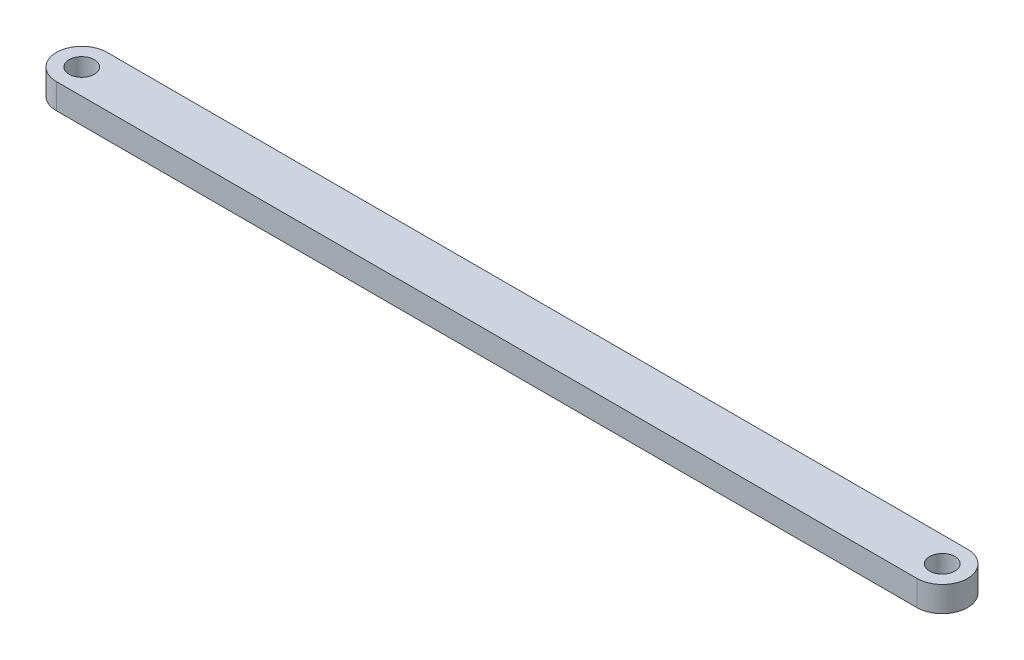
ISO-10303-21;
HEADER;
FILE_DESCRIPTION(('STEP AP214'),'2;1');
FILE_NAME('part.step','',(''),(''),'','','');
FILE_SCHEMA(('AUTOMOTIVE_DESIGN { 1 0 10303 214 1 1 1 1 }'));
ENDSEC;
DATA;
#1=APPLICATION_CONTEXT('core data for automotive mechanical design processes');
#2=APPLICATION_PROTOCOL_DEFINITION('international standard','automotive_design',2000,#1);
#3=PRODUCT_CONTEXT('',#1,'mechanical');
#4=PRODUCT('Part','Part','',(#3));
#5=PRODUCT_RELATED_PRODUCT_CATEGORY('part','',(#4));
#6=PRODUCT_DEFINITION_FORMATION('','',#4);
#7=PRODUCT_DEFINITION_CONTEXT('part definition',#1,'design');
#8=PRODUCT_DEFINITION('design','',#6,#7);
#9=PRODUCT_DEFINITION_SHAPE('','',#8);
#10=(LENGTH_UNIT() NAMED_UNIT(*) SI_UNIT(.MILLI.,.METRE.));
#11=(NAMED_UNIT(*) PLANE_ANGLE_UNIT() SI_UNIT($,.RADIAN.));
#12=(NAMED_UNIT(*) SI_UNIT($,.STERADIAN.) SOLID_ANGLE_UNIT());
#13=UNCERTAINTY_MEASURE_WITH_UNIT(LENGTH_MEASURE(1.E-05),#10,'distance_accuracy_value','');
#14=(GEOMETRIC_REPRESENTATION_CONTEXT(3) GLOBAL_UNCERTAINTY_ASSIGNED_CONTEXT((#13)) GLOBAL_UNIT_ASSIGNED_CONTEXT((#10,
#11,#12)) REPRESENTATION_CONTEXT('',''));
#15=CARTESIAN_POINT('',(0.,0.,0.));
#16=DIRECTION('',(0.,0.,1.));
#17=DIRECTION('',(1.,0.,0.));
#18=AXIS2_PLACEMENT_3D('',#15,#16,#17);
#19=CARTESIAN_POINT('',(85.,5.,0.));
#20=DIRECTION('',(0.,-1.,0.));
#21=DIRECTION('',(0.,0.,-1.));
#22=AXIS2_PLACEMENT_3D('',#19,#20,#21);
#23=CYLINDRICAL_SURFACE('',#22,5.);
#24=CARTESIAN_POINT('',(85.,0.,0.));
#25=DIRECTION('',(0.,1.,0.));
#26=DIRECTION('',(0.,0.,1.));
#27=AXIS2_PLACEMENT_3D('',#24,#25,#26);
#28=CIRCLE('',#27,5.);
#29=CARTESIAN_POINT('',(85.,0.,5.));
#30=VERTEX_POINT('',#29);
#31=CARTESIAN_POINT('',(85.,0.,-5.));
#32=VERTEX_POINT('',#31);
#33=EDGE_CURVE('E102',#30,#32,#28,.T.);
#34=ORIENTED_EDGE('',*,*,#33,.T.);
#35=DIRECTION('',(0.,-1.,0.));
#36=VECTOR('',#35,1.);
#37=CARTESIAN_POINT('',(85.,5.,-5.));
#38=LINE('',#37,#36);
#39=CARTESIAN_POINT('',(85.,5.,-5.));
#40=VERTEX_POINT('',#39);
#41=EDGE_CURVE('E11',#40,#32,#38,.T.);
#42=ORIENTED_EDGE('',*,*,#41,.F.);
#43=CARTESIAN_POINT('',(85.,5.,0.));
#44=DIRECTION('',(0.,1.,0.));
#45=DIRECTION('',(0.,0.,1.));
#46=AXIS2_PLACEMENT_3D('',#43,#44,#45);
#47=CIRCLE('',#46,5.);
#48=CARTESIAN_POINT('',(85.,5.,5.));
#49=VERTEX_POINT('',#48);
#50=EDGE_CURVE('E90',#49,#40,#47,.T.);
#51=ORIENTED_EDGE('',*,*,#50,.F.);
#52=DIRECTION('',(0.,-1.,0.));
#53=VECTOR('',#52,1.);
#54=CARTESIAN_POINT('',(85.,5.,5.));
#55=LINE('',#54,#53);
#56=EDGE_CURVE('E98',#49,#30,#55,.T.);
#57=ORIENTED_EDGE('',*,*,#56,.T.);
#58=EDGE_LOOP('',(#34,#42,#51,#57));
#59=FACE_BOUND('',#58,.T.);
#60=ADVANCED_FACE('F39',(#59),#23,.T.);
#61=CARTESIAN_POINT('',(-85.,5.,-5.));
#62=DIRECTION('',(0.,0.,1.));
#63=DIRECTION('',(1.,0.,0.));
#64=AXIS2_PLACEMENT_3D('',#61,#62,#63);
#65=PLANE('',#64);
#66=DIRECTION('',(-1.,0.,0.));
#67=VECTOR('',#66,1.);
#68=CARTESIAN_POINT('',(-85.,0.,-5.));
#69=LINE('',#68,#67);
#70=CARTESIAN_POINT('',(-85.,0.,-5.));
#71=VERTEX_POINT('',#70);
#72=EDGE_CURVE('E94',#32,#71,#69,.T.);
#73=ORIENTED_EDGE('',*,*,#72,.T.);
#74=DIRECTION('',(0.,-1.,0.));
#75=VECTOR('',#74,1.);
#76=CARTESIAN_POINT('',(-85.,5.,-5.));
#77=LINE('',#76,#75);
#78=CARTESIAN_POINT('',(-85.,5.,-5.));
#79=VERTEX_POINT('',#78);
#80=EDGE_CURVE('E47',#79,#71,#77,.T.);
#81=ORIENTED_EDGE('',*,*,#80,.F.);
#82=DIRECTION('',(-1.,0.,0.));
#83=VECTOR('',#82,1.);
#84=CARTESIAN_POINT('',(-85.,5.,-5.));
#85=LINE('',#84,#83);
#86=EDGE_CURVE('E85',#40,#79,#85,.T.);
#87=ORIENTED_EDGE('',*,*,#86,.F.);
#88=ORIENTED_EDGE('',*,*,#41,.T.);
#89=EDGE_LOOP('',(#73,#81,#87,#88));
#90=FACE_BOUND('',#89,.T.);
#91=ADVANCED_FACE('F93',(#90),#65,.F.);
#92=CARTESIAN_POINT('',(-85.,5.,0.));
#93=DIRECTION('',(0.,-1.,0.));
#94=DIRECTION('',(0.,0.,-1.));
#95=AXIS2_PLACEMENT_3D('',#92,#93,#94);
#96=CYLINDRICAL_SURFACE('',#95,5.);
#97=CARTESIAN_POINT('',(-85.,0.,0.));
#98=DIRECTION('',(0.,1.,0.));
#99=DIRECTION('',(0.,0.,1.));
#100=AXIS2_PLACEMENT_3D('',#97,#98,#99);
#101=CIRCLE('',#100,5.);
#102=CARTESIAN_POINT('',(-85.,0.,5.));
#103=VERTEX_POINT('',#102);
#104=EDGE_CURVE('E72',#71,#103,#101,.T.);
#105=ORIENTED_EDGE('',*,*,#104,.T.);
#106=DIRECTION('',(0.,-1.,0.));
#107=VECTOR('',#106,1.);
#108=CARTESIAN_POINT('',(-85.,5.,5.));
#109=LINE('',#108,#107);
#110=CARTESIAN_POINT('',(-85.,5.,5.));
#111=VERTEX_POINT('',#110);
#112=EDGE_CURVE('E95',#111,#103,#109,.T.);
#113=ORIENTED_EDGE('',*,*,#112,.F.);
#114=CARTESIAN_POINT('',(-85.,5.,0.));
#115=DIRECTION('',(0.,1.,0.));
#116=DIRECTION('',(0.,0.,1.));
#117=AXIS2_PLACEMENT_3D('',#114,#115,#116);
#118=CIRCLE('',#117,5.);
#119=EDGE_CURVE('E88',#79,#111,#118,.T.);
#120=ORIENTED_EDGE('',*,*,#119,.F.);
#121=ORIENTED_EDGE('',*,*,#80,.T.);
#122=EDGE_LOOP('',(#105,#113,#120,#121));
#123=FACE_BOUND('',#122,.T.);
#124=ADVANCED_FACE('F96',(#123),#96,.T.);
#125=CARTESIAN_POINT('',(-85.,5.,5.));
#126=DIRECTION('',(0.,0.,-1.));
#127=DIRECTION('',(-1.,0.,0.));
#128=AXIS2_PLACEMENT_3D('',#125,#126,#127);
#129=PLANE('',#128);
#130=DIRECTION('',(1.,0.,0.));
#131=VECTOR('',#130,1.);
#132=CARTESIAN_POINT('',(-85.,0.,5.));
#133=LINE('',#132,#131);
#134=EDGE_CURVE('E78',#103,#30,#133,.T.);
#135=ORIENTED_EDGE('',*,*,#134,.T.);
#136=ORIENTED_EDGE('',*,*,#56,.F.);
#137=DIRECTION('',(1.,0.,0.));
#138=VECTOR('',#137,1.);
#139=CARTESIAN_POINT('',(-85.,5.,5.));
#140=LINE('',#139,#138);
#141=EDGE_CURVE('E55',#111,#49,#140,.T.);
#142=ORIENTED_EDGE('',*,*,#141,.F.);
#143=ORIENTED_EDGE('',*,*,#112,.T.);
#144=EDGE_LOOP('',(#135,#136,#142,#143));
#145=FACE_BOUND('',#144,.T.);
#146=ADVANCED_FACE('F110',(#145),#129,.F.);
#147=CARTESIAN_POINT('',(85.,5.,0.));
#148=DIRECTION('',(0.,1.,0.));
#149=DIRECTION('',(0.,0.,1.));
#150=AXIS2_PLACEMENT_3D('',#147,#148,#149);
#151=PLANE('',#150);
#152=CARTESIAN_POINT('',(-85.,5.,0.));
#153=DIRECTION('',(0.,1.,0.));
#154=DIRECTION('',(0.,0.,1.));
#155=AXIS2_PLACEMENT_3D('',#152,#153,#154);
#156=CIRCLE('',#155,2.50000000000001);
#157=CARTESIAN_POINT('',(-85.,5.,2.50000000000001));
#158=VERTEX_POINT('',#157);
#159=EDGE_CURVE('E122',#158,#158,#156,.T.);
#160=ORIENTED_EDGE('',*,*,#159,.F.);
#161=EDGE_LOOP('',(#160));
#162=FACE_BOUND('',#161,.T.);
#163=CARTESIAN_POINT('',(85.,5.,0.));
#164=DIRECTION('',(0.,1.,0.));
#165=DIRECTION('',(0.,0.,1.));
#166=AXIS2_PLACEMENT_3D('',#163,#164,#165);
#167=CIRCLE('',#166,2.50000000000001);
#168=CARTESIAN_POINT('',(85.,5.,2.50000000000001));
#169=VERTEX_POINT('',#168);
#170=EDGE_CURVE('E119',#169,#169,#167,.T.);
#171=ORIENTED_EDGE('',*,*,#170,.F.);
#172=EDGE_LOOP('',(#171));
#173=FACE_BOUND('',#172,.T.);
#174=ORIENTED_EDGE('',*,*,#50,.T.);
#175=ORIENTED_EDGE('',*,*,#86,.T.);
#176=ORIENTED_EDGE('',*,*,#119,.T.);
#177=ORIENTED_EDGE('',*,*,#141,.T.);
#178=EDGE_LOOP('',(#174,#175,#176,#177));
#179=FACE_BOUND('',#178,.T.);
#180=ADVANCED_FACE('F86',(#162,#173,#179),#151,.T.);
#181=CARTESIAN_POINT('',(85.,0.,0.));
#182=DIRECTION('',(0.,1.,0.));
#183=DIRECTION('',(0.,0.,1.));
#184=AXIS2_PLACEMENT_3D('',#181,#182,#183);
#185=PLANE('',#184);
#186=CARTESIAN_POINT('',(-85.,0.,0.));
#187=DIRECTION('',(0.,1.,0.));
#188=DIRECTION('',(0.,0.,1.));
#189=AXIS2_PLACEMENT_3D('',#186,#187,#188);
#190=CIRCLE('',#189,2.50000000000001);
#191=CARTESIAN_POINT('',(-85.,0.,2.50000000000001));
#192=VERTEX_POINT('',#191);
#193=EDGE_CURVE('E105',#192,#192,#190,.T.);
#194=ORIENTED_EDGE('',*,*,#193,.T.);
#195=EDGE_LOOP('',(#194));
#196=FACE_BOUND('',#195,.T.);
#197=CARTESIAN_POINT('',(85.,0.,0.));
#198=DIRECTION('',(0.,1.,0.));
#199=DIRECTION('',(0.,0.,1.));
#200=AXIS2_PLACEMENT_3D('',#197,#198,#199);
#201=CIRCLE('',#200,2.50000000000001);
#202=CARTESIAN_POINT('',(85.,0.,2.50000000000001));
#203=VERTEX_POINT('',#202);
#204=EDGE_CURVE('E116',#203,#203,#201,.T.);
#205=ORIENTED_EDGE('',*,*,#204,.T.);
#206=EDGE_LOOP('',(#205));
#207=FACE_BOUND('',#206,.T.);
#208=ORIENTED_EDGE('',*,*,#33,.F.);
#209=ORIENTED_EDGE('',*,*,#134,.F.);
#210=ORIENTED_EDGE('',*,*,#104,.F.);
#211=ORIENTED_EDGE('',*,*,#72,.F.);
#212=EDGE_LOOP('',(#208,#209,#210,#211));
#213=FACE_BOUND('',#212,.T.);
#214=ADVANCED_FACE('F113',(#196,#207,#213),#185,.F.);
#215=CARTESIAN_POINT('',(85.,0.,0.));
#216=DIRECTION('',(0.,1.,0.));
#217=DIRECTION('',(0.,0.,1.));
#218=AXIS2_PLACEMENT_3D('',#215,#216,#217);
#219=CYLINDRICAL_SURFACE('',#218,2.50000000000001);
#220=ORIENTED_EDGE('',*,*,#204,.F.);
#221=EDGE_LOOP('',(#220));
#222=FACE_BOUND('',#221,.T.);
#223=ORIENTED_EDGE('',*,*,#170,.T.);
#224=EDGE_LOOP('',(#223));
#225=FACE_BOUND('',#224,.T.);
#226=ADVANCED_FACE('F133',(#222,#225),#219,.F.);
#227=CARTESIAN_POINT('',(-85.,0.,0.));
#228=DIRECTION('',(0.,1.,0.));
#229=DIRECTION('',(0.,0.,1.));
#230=AXIS2_PLACEMENT_3D('',#227,#228,#229);
#231=CYLINDRICAL_SURFACE('',#230,2.50000000000001);
#232=ORIENTED_EDGE('',*,*,#193,.F.);
#233=EDGE_LOOP('',(#232));
#234=FACE_BOUND('',#233,.T.);
#235=ORIENTED_EDGE('',*,*,#159,.T.);
#236=EDGE_LOOP('',(#235));
#237=FACE_BOUND('',#236,.T.);
#238=ADVANCED_FACE('F130',(#234,#237),#231,.F.);
#239=CLOSED_SHELL('',(#60,#91,#124,#146,#180,#214,#226,#238));
#240=MANIFOLD_SOLID_BREP('B2',#239);
#241=ADVANCED_BREP_SHAPE_REPRESENTATION('',(#18,#240),#14);
#242=SHAPE_DEFINITION_REPRESENTATION(#9,#241);
ENDSEC;
END-ISO-10303-21;
